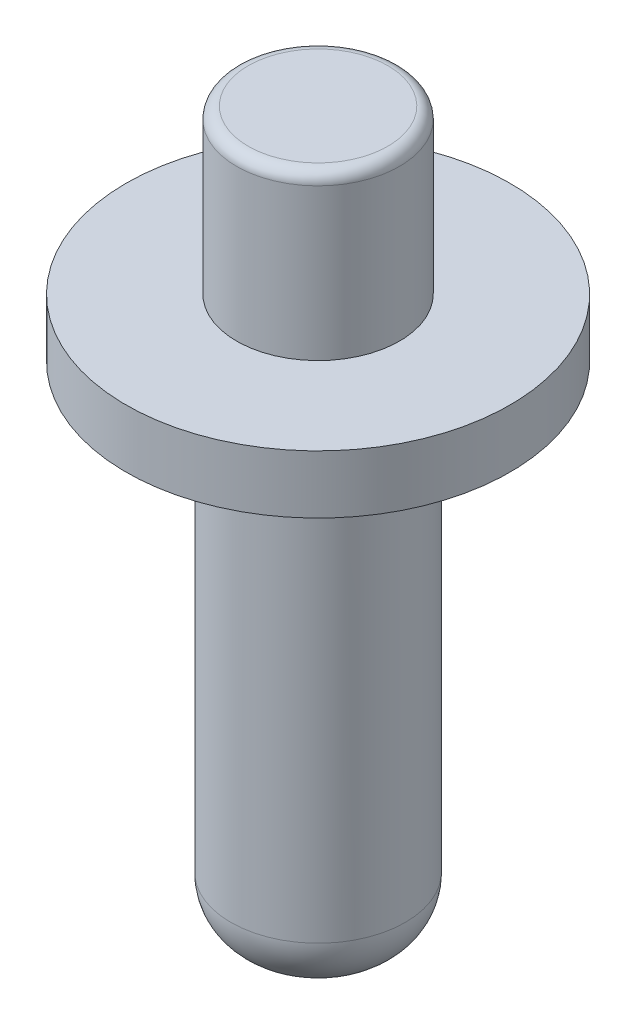
ISO-10303-21;
HEADER;
FILE_DESCRIPTION(('STEP AP214'),'2;1');
FILE_NAME('part.step','',(''),(''),'','','');
FILE_SCHEMA(('AUTOMOTIVE_DESIGN { 1 0 10303 214 1 1 1 1 }'));
ENDSEC;
DATA;
#1=APPLICATION_CONTEXT('core data for automotive mechanical design processes');
#2=APPLICATION_PROTOCOL_DEFINITION('international standard','automotive_design',2000,#1);
#3=PRODUCT_CONTEXT('',#1,'mechanical');
#4=PRODUCT('Part','Part','',(#3));
#5=PRODUCT_RELATED_PRODUCT_CATEGORY('part','',(#4));
#6=PRODUCT_DEFINITION_FORMATION('','',#4);
#7=PRODUCT_DEFINITION_CONTEXT('part definition',#1,'design');
#8=PRODUCT_DEFINITION('design','',#6,#7);
#9=PRODUCT_DEFINITION_SHAPE('','',#8);
#10=(LENGTH_UNIT() NAMED_UNIT(*) SI_UNIT(.MILLI.,.METRE.));
#11=(NAMED_UNIT(*) PLANE_ANGLE_UNIT() SI_UNIT($,.RADIAN.));
#12=(NAMED_UNIT(*) SI_UNIT($,.STERADIAN.) SOLID_ANGLE_UNIT());
#13=UNCERTAINTY_MEASURE_WITH_UNIT(LENGTH_MEASURE(1.E-05),#10,'distance_accuracy_value','');
#14=(GEOMETRIC_REPRESENTATION_CONTEXT(3) GLOBAL_UNCERTAINTY_ASSIGNED_CONTEXT((#13)) GLOBAL_UNIT_ASSIGNED_CONTEXT((#10,
#11,#12)) REPRESENTATION_CONTEXT('',''));
#15=CARTESIAN_POINT('',(0.,0.,0.));
#16=DIRECTION('',(0.,0.,1.));
#17=DIRECTION('',(1.,0.,0.));
#18=AXIS2_PLACEMENT_3D('',#15,#16,#17);
#19=CARTESIAN_POINT('',(0.,-4.3,0.));
#20=DIRECTION('',(0.,-1.,0.));
#21=DIRECTION('',(1.,0.,0.));
#22=AXIS2_PLACEMENT_3D('',#19,#20,#21);
#23=PLANE('',#22);
#24=CARTESIAN_POINT('',(0.,-4.3,0.));
#25=DIRECTION('',(0.,-1.,0.));
#26=DIRECTION('',(1.,0.,0.));
#27=AXIS2_PLACEMENT_3D('',#24,#25,#26);
#28=CIRCLE('',#27,0.25);
#29=CARTESIAN_POINT('',(0.250000000000002,-4.3,0.));
#30=VERTEX_POINT('',#29);
#31=EDGE_CURVE('E10',#30,#30,#28,.T.);
#32=ORIENTED_EDGE('',*,*,#31,.T.);
#33=EDGE_LOOP('',(#32));
#34=FACE_BOUND('',#33,.T.);
#35=ADVANCED_FACE('F31',(#34),#23,.T.);
#36=CARTESIAN_POINT('',(0.,12.8872424560707,0.));
#37=DIRECTION('',(0.,1.,0.));
#38=DIRECTION('',(-1.,0.,0.));
#39=AXIS2_PLACEMENT_3D('',#36,#37,#38);
#40=CYLINDRICAL_SURFACE('',#39,0.75);
#41=CARTESIAN_POINT('',(0.,-3.8,0.));
#42=DIRECTION('',(0.,-1.,0.));
#43=DIRECTION('',(1.,0.,0.));
#44=AXIS2_PLACEMENT_3D('',#41,#42,#43);
#45=CIRCLE('',#44,0.75);
#46=CARTESIAN_POINT('',(0.750000000000002,-3.8,0.));
#47=VERTEX_POINT('',#46);
#48=EDGE_CURVE('E38',#47,#47,#45,.F.);
#49=ORIENTED_EDGE('',*,*,#48,.T.);
#50=EDGE_LOOP('',(#49));
#51=FACE_BOUND('',#50,.T.);
#52=CARTESIAN_POINT('',(0.,0.,0.));
#53=DIRECTION('',(0.,1.,0.));
#54=DIRECTION('',(-1.,0.,0.));
#55=AXIS2_PLACEMENT_3D('',#52,#53,#54);
#56=CIRCLE('',#55,0.750000000000001);
#57=CARTESIAN_POINT('',(-0.749999999999998,0.,0.));
#58=VERTEX_POINT('',#57);
#59=EDGE_CURVE('E51',#58,#58,#56,.T.);
#60=ORIENTED_EDGE('',*,*,#59,.F.);
#61=EDGE_LOOP('',(#60));
#62=FACE_BOUND('',#61,.T.);
#63=ADVANCED_FACE('F82',(#51,#62),#40,.T.);
#64=CARTESIAN_POINT('',(-0.749999999999998,0.,0.));
#65=DIRECTION('',(0.,-1.,0.));
#66=DIRECTION('',(1.,0.,0.));
#67=AXIS2_PLACEMENT_3D('',#64,#65,#66);
#68=PLANE('',#67);
#69=ORIENTED_EDGE('',*,*,#59,.T.);
#70=EDGE_LOOP('',(#69));
#71=FACE_BOUND('',#70,.T.);
#72=CARTESIAN_POINT('',(0.,0.,0.));
#73=DIRECTION('',(0.,1.,0.));
#74=DIRECTION('',(-1.,0.,0.));
#75=AXIS2_PLACEMENT_3D('',#72,#73,#74);
#76=CIRCLE('',#75,1.65);
#77=CARTESIAN_POINT('',(-1.65,0.,0.));
#78=VERTEX_POINT('',#77);
#79=EDGE_CURVE('E54',#78,#78,#76,.T.);
#80=ORIENTED_EDGE('',*,*,#79,.F.);
#81=EDGE_LOOP('',(#80));
#82=FACE_BOUND('',#81,.T.);
#83=ADVANCED_FACE('F78',(#71,#82),#68,.T.);
#84=CARTESIAN_POINT('',(0.,12.8872424560707,0.));
#85=DIRECTION('',(0.,1.,0.));
#86=DIRECTION('',(-1.,0.,0.));
#87=AXIS2_PLACEMENT_3D('',#84,#85,#86);
#88=CYLINDRICAL_SURFACE('',#87,1.65);
#89=ORIENTED_EDGE('',*,*,#79,.T.);
#90=EDGE_LOOP('',(#89));
#91=FACE_BOUND('',#90,.T.);
#92=CARTESIAN_POINT('',(0.,0.499999999999999,0.));
#93=DIRECTION('',(0.,1.,0.));
#94=DIRECTION('',(-1.,0.,0.));
#95=AXIS2_PLACEMENT_3D('',#92,#93,#94);
#96=CIRCLE('',#95,1.65);
#97=CARTESIAN_POINT('',(-1.65,0.499999999999999,0.));
#98=VERTEX_POINT('',#97);
#99=EDGE_CURVE('E57',#98,#98,#96,.T.);
#100=ORIENTED_EDGE('',*,*,#99,.F.);
#101=EDGE_LOOP('',(#100));
#102=FACE_BOUND('',#101,.T.);
#103=ADVANCED_FACE('F68',(#91,#102),#88,.T.);
#104=CARTESIAN_POINT('',(-1.65,0.499999999999999,0.));
#105=DIRECTION('',(0.,1.,0.));
#106=DIRECTION('',(-1.,0.,0.));
#107=AXIS2_PLACEMENT_3D('',#104,#105,#106);
#108=PLANE('',#107);
#109=ORIENTED_EDGE('',*,*,#99,.T.);
#110=EDGE_LOOP('',(#109));
#111=FACE_BOUND('',#110,.T.);
#112=CARTESIAN_POINT('',(0.,0.499999999999999,0.));
#113=DIRECTION('',(0.,1.,0.));
#114=DIRECTION('',(-1.,0.,0.));
#115=AXIS2_PLACEMENT_3D('',#112,#113,#114);
#116=CIRCLE('',#115,0.7);
#117=CARTESIAN_POINT('',(-0.699999999999998,0.499999999999999,0.));
#118=VERTEX_POINT('',#117);
#119=EDGE_CURVE('E60',#118,#118,#116,.T.);
#120=ORIENTED_EDGE('',*,*,#119,.F.);
#121=EDGE_LOOP('',(#120));
#122=FACE_BOUND('',#121,.T.);
#123=ADVANCED_FACE('F66',(#111,#122),#108,.T.);
#124=CARTESIAN_POINT('',(0.,12.8872424560707,0.));
#125=DIRECTION('',(0.,1.,0.));
#126=DIRECTION('',(-1.,0.,0.));
#127=AXIS2_PLACEMENT_3D('',#124,#125,#126);
#128=CYLINDRICAL_SURFACE('',#127,0.7);
#129=CARTESIAN_POINT('',(0.,1.8,0.));
#130=DIRECTION('',(0.,1.,0.));
#131=DIRECTION('',(-1.,0.,0.));
#132=AXIS2_PLACEMENT_3D('',#129,#130,#131);
#133=CIRCLE('',#132,0.7);
#134=CARTESIAN_POINT('',(-0.699999999999998,1.8,0.));
#135=VERTEX_POINT('',#134);
#136=EDGE_CURVE('E42',#135,#135,#133,.F.);
#137=ORIENTED_EDGE('',*,*,#136,.T.);
#138=EDGE_LOOP('',(#137));
#139=FACE_BOUND('',#138,.T.);
#140=ORIENTED_EDGE('',*,*,#119,.T.);
#141=EDGE_LOOP('',(#140));
#142=FACE_BOUND('',#141,.T.);
#143=ADVANCED_FACE('F64',(#139,#142),#128,.T.);
#144=CARTESIAN_POINT('',(-0.699999999999998,1.9,0.));
#145=DIRECTION('',(0.,1.,0.));
#146=DIRECTION('',(-1.,0.,0.));
#147=AXIS2_PLACEMENT_3D('',#144,#145,#146);
#148=PLANE('',#147);
#149=CARTESIAN_POINT('',(0.,1.9,0.));
#150=DIRECTION('',(0.,1.,0.));
#151=DIRECTION('',(-1.,0.,0.));
#152=AXIS2_PLACEMENT_3D('',#149,#150,#151);
#153=CIRCLE('',#152,0.6);
#154=CARTESIAN_POINT('',(-0.599999999999998,1.9,0.));
#155=VERTEX_POINT('',#154);
#156=EDGE_CURVE('E46',#155,#155,#153,.T.);
#157=ORIENTED_EDGE('',*,*,#156,.T.);
#158=EDGE_LOOP('',(#157));
#159=FACE_BOUND('',#158,.T.);
#160=ADVANCED_FACE('F75',(#159),#148,.T.);
#161=CARTESIAN_POINT('',(0.,1.8,0.));
#162=DIRECTION('',(0.,1.,0.));
#163=DIRECTION('',(-1.,0.,0.));
#164=AXIS2_PLACEMENT_3D('',#161,#162,#163);
#165=TOROIDAL_SURFACE('',#164,0.6,0.1);
#166=ORIENTED_EDGE('',*,*,#136,.F.);
#167=EDGE_LOOP('',(#166));
#168=FACE_BOUND('',#167,.T.);
#169=ORIENTED_EDGE('',*,*,#156,.F.);
#170=EDGE_LOOP('',(#169));
#171=FACE_BOUND('',#170,.T.);
#172=ADVANCED_FACE('F89',(#168,#171),#165,.T.);
#173=CARTESIAN_POINT('',(0.,-3.8,0.));
#174=DIRECTION('',(0.,-1.,0.));
#175=DIRECTION('',(1.,0.,0.));
#176=AXIS2_PLACEMENT_3D('',#173,#174,#175);
#177=DEGENERATE_TOROIDAL_SURFACE('',#176,0.25,0.5,.T.);
#178=ORIENTED_EDGE('',*,*,#31,.F.);
#179=EDGE_LOOP('',(#178));
#180=FACE_BOUND('',#179,.T.);
#181=ORIENTED_EDGE('',*,*,#48,.F.);
#182=EDGE_LOOP('',(#181));
#183=FACE_BOUND('',#182,.T.);
#184=ADVANCED_FACE('F33',(#180,#183),#177,.T.);
#185=CLOSED_SHELL('',(#35,#63,#83,#103,#123,#143,#160,#172,#184));
#186=MANIFOLD_SOLID_BREP('B2',#185);
#187=ADVANCED_BREP_SHAPE_REPRESENTATION('',(#18,#186),#14);
#188=SHAPE_DEFINITION_REPRESENTATION(#9,#187);
ENDSEC;
END-ISO-10303-21;
